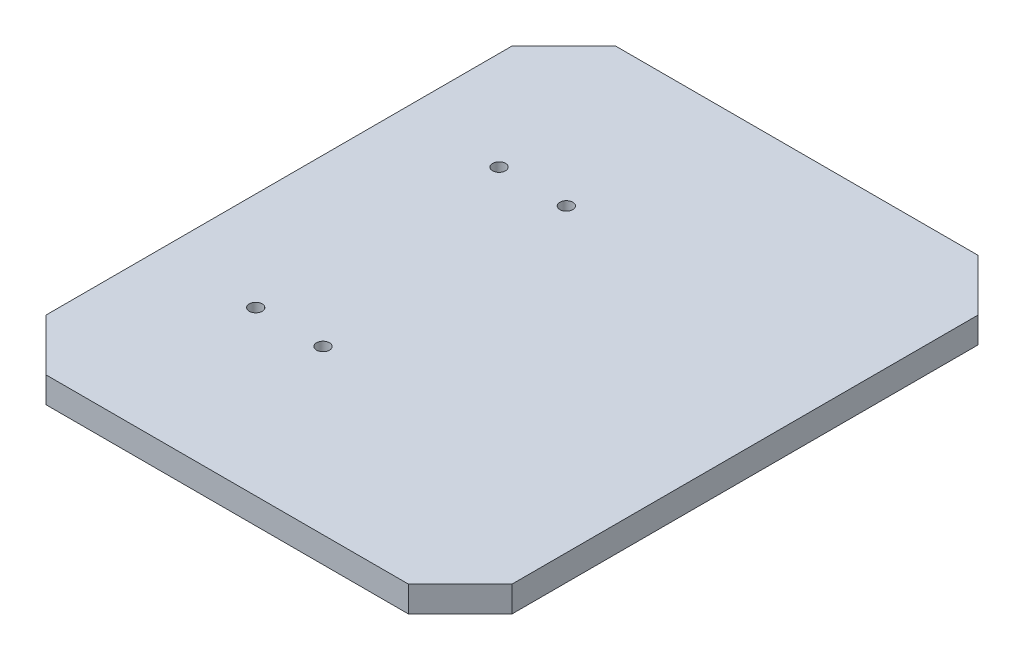
ISO-10303-21;
HEADER;
FILE_DESCRIPTION(('STEP AP214'),'2;1');
FILE_NAME('part.step','',(''),(''),'','','');
FILE_SCHEMA(('AUTOMOTIVE_DESIGN { 1 0 10303 214 1 1 1 1 }'));
ENDSEC;
DATA;
#1=APPLICATION_CONTEXT('core data for automotive mechanical design processes');
#2=APPLICATION_PROTOCOL_DEFINITION('international standard','automotive_design',2000,#1);
#3=PRODUCT_CONTEXT('',#1,'mechanical');
#4=PRODUCT('Part','Part','',(#3));
#5=PRODUCT_RELATED_PRODUCT_CATEGORY('part','',(#4));
#6=PRODUCT_DEFINITION_FORMATION('','',#4);
#7=PRODUCT_DEFINITION_CONTEXT('part definition',#1,'design');
#8=PRODUCT_DEFINITION('design','',#6,#7);
#9=PRODUCT_DEFINITION_SHAPE('','',#8);
#10=(LENGTH_UNIT() NAMED_UNIT(*) SI_UNIT(.MILLI.,.METRE.));
#11=(NAMED_UNIT(*) PLANE_ANGLE_UNIT() SI_UNIT($,.RADIAN.));
#12=(NAMED_UNIT(*) SI_UNIT($,.STERADIAN.) SOLID_ANGLE_UNIT());
#13=UNCERTAINTY_MEASURE_WITH_UNIT(LENGTH_MEASURE(1.E-05),#10,'distance_accuracy_value','');
#14=(GEOMETRIC_REPRESENTATION_CONTEXT(3) GLOBAL_UNCERTAINTY_ASSIGNED_CONTEXT((#13)) GLOBAL_UNIT_ASSIGNED_CONTEXT((#10,
#11,#12)) REPRESENTATION_CONTEXT('',''));
#15=CARTESIAN_POINT('',(0.,0.,0.));
#16=DIRECTION('',(0.,0.,1.));
#17=DIRECTION('',(1.,0.,0.));
#18=AXIS2_PLACEMENT_3D('',#15,#16,#17);
#19=CARTESIAN_POINT('',(90.,5.,0.));
#20=DIRECTION('',(0.,0.,-1.));
#21=DIRECTION('',(-1.,0.,0.));
#22=AXIS2_PLACEMENT_3D('',#19,#20,#21);
#23=PLANE('',#22);
#24=DIRECTION('',(1.,0.,0.));
#25=VECTOR('',#24,1.);
#26=CARTESIAN_POINT('',(90.,0.,0.));
#27=LINE('',#26,#25);
#28=CARTESIAN_POINT('',(10.,0.,0.));
#29=VERTEX_POINT('',#28);
#30=CARTESIAN_POINT('',(80.,0.,0.));
#31=VERTEX_POINT('',#30);
#32=EDGE_CURVE('E161',#29,#31,#27,.T.);
#33=ORIENTED_EDGE('',*,*,#32,.T.);
#34=DIRECTION('',(0.,1.,0.));
#35=VECTOR('',#34,1.);
#36=CARTESIAN_POINT('',(80.,5.,0.));
#37=LINE('',#36,#35);
#38=CARTESIAN_POINT('',(80.,5.,0.));
#39=VERTEX_POINT('',#38);
#40=EDGE_CURVE('E11',#31,#39,#37,.T.);
#41=ORIENTED_EDGE('',*,*,#40,.T.);
#42=DIRECTION('',(1.,0.,0.));
#43=VECTOR('',#42,1.);
#44=CARTESIAN_POINT('',(90.,5.,0.));
#45=LINE('',#44,#43);
#46=CARTESIAN_POINT('',(10.,5.,0.));
#47=VERTEX_POINT('',#46);
#48=EDGE_CURVE('E129',#47,#39,#45,.T.);
#49=ORIENTED_EDGE('',*,*,#48,.F.);
#50=DIRECTION('',(0.,-1.,0.));
#51=VECTOR('',#50,1.);
#52=CARTESIAN_POINT('',(10.,5.,0.));
#53=LINE('',#52,#51);
#54=EDGE_CURVE('E45',#47,#29,#53,.T.);
#55=ORIENTED_EDGE('',*,*,#54,.T.);
#56=EDGE_LOOP('',(#33,#41,#49,#55));
#57=FACE_BOUND('',#56,.T.);
#58=ADVANCED_FACE('F37',(#57),#23,.F.);
#59=CARTESIAN_POINT('',(90.,5.,-110.));
#60=DIRECTION('',(-1.,0.,0.));
#61=DIRECTION('',(0.,0.,1.));
#62=AXIS2_PLACEMENT_3D('',#59,#60,#61);
#63=PLANE('',#62);
#64=DIRECTION('',(0.,0.,-1.));
#65=VECTOR('',#64,1.);
#66=CARTESIAN_POINT('',(90.,0.,-110.));
#67=LINE('',#66,#65);
#68=CARTESIAN_POINT('',(90.,0.,-10.));
#69=VERTEX_POINT('',#68);
#70=CARTESIAN_POINT('',(90.,0.,-100.));
#71=VERTEX_POINT('',#70);
#72=EDGE_CURVE('E134',#69,#71,#67,.T.);
#73=ORIENTED_EDGE('',*,*,#72,.T.);
#74=DIRECTION('',(0.,1.,0.));
#75=VECTOR('',#74,1.);
#76=CARTESIAN_POINT('',(90.,5.,-100.));
#77=LINE('',#76,#75);
#78=CARTESIAN_POINT('',(90.,5.,-100.));
#79=VERTEX_POINT('',#78);
#80=EDGE_CURVE('E52',#71,#79,#77,.T.);
#81=ORIENTED_EDGE('',*,*,#80,.T.);
#82=DIRECTION('',(0.,0.,-1.));
#83=VECTOR('',#82,1.);
#84=CARTESIAN_POINT('',(90.,5.,-110.));
#85=LINE('',#84,#83);
#86=CARTESIAN_POINT('',(90.,5.,-10.));
#87=VERTEX_POINT('',#86);
#88=EDGE_CURVE('E132',#87,#79,#85,.T.);
#89=ORIENTED_EDGE('',*,*,#88,.F.);
#90=DIRECTION('',(0.,-1.,0.));
#91=VECTOR('',#90,1.);
#92=CARTESIAN_POINT('',(90.,5.,-10.));
#93=LINE('',#92,#91);
#94=EDGE_CURVE('E153',#87,#69,#93,.T.);
#95=ORIENTED_EDGE('',*,*,#94,.T.);
#96=EDGE_LOOP('',(#73,#81,#89,#95));
#97=FACE_BOUND('',#96,.T.);
#98=ADVANCED_FACE('F226',(#97),#63,.F.);
#99=CARTESIAN_POINT('',(0.,5.,-110.));
#100=DIRECTION('',(0.,0.,1.));
#101=DIRECTION('',(1.,0.,0.));
#102=AXIS2_PLACEMENT_3D('',#99,#100,#101);
#103=PLANE('',#102);
#104=DIRECTION('',(-1.,0.,0.));
#105=VECTOR('',#104,1.);
#106=CARTESIAN_POINT('',(0.,0.,-110.));
#107=LINE('',#106,#105);
#108=CARTESIAN_POINT('',(79.9999999999999,0.,-110.));
#109=VERTEX_POINT('',#108);
#110=CARTESIAN_POINT('',(10.,0.,-110.));
#111=VERTEX_POINT('',#110);
#112=EDGE_CURVE('E130',#109,#111,#107,.T.);
#113=ORIENTED_EDGE('',*,*,#112,.T.);
#114=DIRECTION('',(0.,1.,0.));
#115=VECTOR('',#114,1.);
#116=CARTESIAN_POINT('',(10.,5.,-110.));
#117=LINE('',#116,#115);
#118=CARTESIAN_POINT('',(10.,5.,-110.));
#119=VERTEX_POINT('',#118);
#120=EDGE_CURVE('E108',#111,#119,#117,.T.);
#121=ORIENTED_EDGE('',*,*,#120,.T.);
#122=DIRECTION('',(-1.,0.,0.));
#123=VECTOR('',#122,1.);
#124=CARTESIAN_POINT('',(0.,5.,-110.));
#125=LINE('',#124,#123);
#126=CARTESIAN_POINT('',(79.9999999999999,5.,-110.));
#127=VERTEX_POINT('',#126);
#128=EDGE_CURVE('E173',#127,#119,#125,.T.);
#129=ORIENTED_EDGE('',*,*,#128,.F.);
#130=DIRECTION('',(0.,-1.,0.));
#131=VECTOR('',#130,1.);
#132=CARTESIAN_POINT('',(80.,5.,-110.));
#133=LINE('',#132,#131);
#134=EDGE_CURVE('E113',#127,#109,#133,.T.);
#135=ORIENTED_EDGE('',*,*,#134,.T.);
#136=EDGE_LOOP('',(#113,#121,#129,#135));
#137=FACE_BOUND('',#136,.T.);
#138=ADVANCED_FACE('F231',(#137),#103,.F.);
#139=CARTESIAN_POINT('',(0.,5.,0.));
#140=DIRECTION('',(1.,0.,0.));
#141=DIRECTION('',(0.,0.,-1.));
#142=AXIS2_PLACEMENT_3D('',#139,#140,#141);
#143=PLANE('',#142);
#144=DIRECTION('',(0.,0.,1.));
#145=VECTOR('',#144,1.);
#146=CARTESIAN_POINT('',(0.,5.,0.));
#147=LINE('',#146,#145);
#148=CARTESIAN_POINT('',(0.,5.,-100.));
#149=VERTEX_POINT('',#148);
#150=CARTESIAN_POINT('',(0.,5.,-10.));
#151=VERTEX_POINT('',#150);
#152=EDGE_CURVE('E123',#149,#151,#147,.T.);
#153=ORIENTED_EDGE('',*,*,#152,.F.);
#154=DIRECTION('',(0.,-1.,0.));
#155=VECTOR('',#154,1.);
#156=CARTESIAN_POINT('',(0.,5.,-100.));
#157=LINE('',#156,#155);
#158=CARTESIAN_POINT('',(0.,0.,-100.));
#159=VERTEX_POINT('',#158);
#160=EDGE_CURVE('E107',#149,#159,#157,.T.);
#161=ORIENTED_EDGE('',*,*,#160,.T.);
#162=DIRECTION('',(0.,0.,1.));
#163=VECTOR('',#162,1.);
#164=CARTESIAN_POINT('',(0.,0.,0.));
#165=LINE('',#164,#163);
#166=CARTESIAN_POINT('',(0.,0.,-10.));
#167=VERTEX_POINT('',#166);
#168=EDGE_CURVE('E120',#159,#167,#165,.T.);
#169=ORIENTED_EDGE('',*,*,#168,.T.);
#170=DIRECTION('',(0.,1.,0.));
#171=VECTOR('',#170,1.);
#172=CARTESIAN_POINT('',(0.,5.,-10.));
#173=LINE('',#172,#171);
#174=EDGE_CURVE('E125',#167,#151,#173,.T.);
#175=ORIENTED_EDGE('',*,*,#174,.T.);
#176=EDGE_LOOP('',(#153,#161,#169,#175));
#177=FACE_BOUND('',#176,.T.);
#178=ADVANCED_FACE('F119',(#177),#143,.F.);
#179=CARTESIAN_POINT('',(0.,5.,0.));
#180=DIRECTION('',(0.,-1.,0.));
#181=DIRECTION('',(0.,0.,-1.));
#182=AXIS2_PLACEMENT_3D('',#179,#180,#181);
#183=PLANE('',#182);
#184=CARTESIAN_POINT('',(19.,5.,-78.5));
#185=DIRECTION('',(0.,-1.,0.));
#186=DIRECTION('',(0.,0.,-1.));
#187=AXIS2_PLACEMENT_3D('',#184,#185,#186);
#188=CIRCLE('',#187,1.25);
#189=CARTESIAN_POINT('',(19.,5.,-79.75));
#190=VERTEX_POINT('',#189);
#191=EDGE_CURVE('E191',#190,#190,#188,.T.);
#192=ORIENTED_EDGE('',*,*,#191,.T.);
#193=EDGE_LOOP('',(#192));
#194=FACE_BOUND('',#193,.T.);
#195=CARTESIAN_POINT('',(19.,5.,-31.5));
#196=DIRECTION('',(0.,-1.,0.));
#197=DIRECTION('',(0.,0.,-1.));
#198=AXIS2_PLACEMENT_3D('',#195,#196,#197);
#199=CIRCLE('',#198,1.25);
#200=CARTESIAN_POINT('',(19.,5.,-32.75));
#201=VERTEX_POINT('',#200);
#202=EDGE_CURVE('E185',#201,#201,#199,.T.);
#203=ORIENTED_EDGE('',*,*,#202,.T.);
#204=EDGE_LOOP('',(#203));
#205=FACE_BOUND('',#204,.T.);
#206=CARTESIAN_POINT('',(32.,5.,-31.5));
#207=DIRECTION('',(0.,-1.,0.));
#208=DIRECTION('',(0.,0.,-1.));
#209=AXIS2_PLACEMENT_3D('',#206,#207,#208);
#210=CIRCLE('',#209,1.25);
#211=CARTESIAN_POINT('',(32.,5.,-32.75));
#212=VERTEX_POINT('',#211);
#213=EDGE_CURVE('E179',#212,#212,#210,.T.);
#214=ORIENTED_EDGE('',*,*,#213,.T.);
#215=EDGE_LOOP('',(#214));
#216=FACE_BOUND('',#215,.T.);
#217=CARTESIAN_POINT('',(32.,5.,-78.5));
#218=DIRECTION('',(0.,-1.,0.));
#219=DIRECTION('',(0.,0.,-1.));
#220=AXIS2_PLACEMENT_3D('',#217,#218,#219);
#221=CIRCLE('',#220,1.25);
#222=CARTESIAN_POINT('',(32.,5.,-79.75));
#223=VERTEX_POINT('',#222);
#224=EDGE_CURVE('E166',#223,#223,#221,.T.);
#225=ORIENTED_EDGE('',*,*,#224,.T.);
#226=EDGE_LOOP('',(#225));
#227=FACE_BOUND('',#226,.T.);
#228=ORIENTED_EDGE('',*,*,#128,.T.);
#229=DIRECTION('',(0.707106781186548,0.,-0.707106781186548));
#230=VECTOR('',#229,1.);
#231=CARTESIAN_POINT('',(0.,5.,-100.));
#232=LINE('',#231,#230);
#233=EDGE_CURVE('E151',#119,#149,#232,.F.);
#234=ORIENTED_EDGE('',*,*,#233,.T.);
#235=ORIENTED_EDGE('',*,*,#152,.T.);
#236=DIRECTION('',(-0.707106781186548,0.,-0.707106781186548));
#237=VECTOR('',#236,1.);
#238=CARTESIAN_POINT('',(10.,5.,0.));
#239=LINE('',#238,#237);
#240=EDGE_CURVE('E146',#151,#47,#239,.F.);
#241=ORIENTED_EDGE('',*,*,#240,.T.);
#242=ORIENTED_EDGE('',*,*,#48,.T.);
#243=DIRECTION('',(-0.707106781186547,0.,0.707106781186548));
#244=VECTOR('',#243,1.);
#245=CARTESIAN_POINT('',(90.,5.,-10.));
#246=LINE('',#245,#244);
#247=EDGE_CURVE('E59',#39,#87,#246,.F.);
#248=ORIENTED_EDGE('',*,*,#247,.T.);
#249=ORIENTED_EDGE('',*,*,#88,.T.);
#250=DIRECTION('',(0.707106781186548,0.,0.707106781186548));
#251=VECTOR('',#250,1.);
#252=CARTESIAN_POINT('',(80.,5.,-110.));
#253=LINE('',#252,#251);
#254=EDGE_CURVE('E149',#79,#127,#253,.F.);
#255=ORIENTED_EDGE('',*,*,#254,.T.);
#256=EDGE_LOOP('',(#228,#234,#235,#241,#242,#248,#249,#255));
#257=FACE_BOUND('',#256,.T.);
#258=ADVANCED_FACE('F202',(#194,#205,#216,#227,#257),#183,.F.);
#259=CARTESIAN_POINT('',(0.,0.,0.));
#260=DIRECTION('',(0.,-1.,0.));
#261=DIRECTION('',(0.,0.,-1.));
#262=AXIS2_PLACEMENT_3D('',#259,#260,#261);
#263=PLANE('',#262);
#264=CARTESIAN_POINT('',(19.,0.,-78.5));
#265=DIRECTION('',(0.,-1.,0.));
#266=DIRECTION('',(0.,0.,-1.));
#267=AXIS2_PLACEMENT_3D('',#264,#265,#266);
#268=CIRCLE('',#267,1.25);
#269=CARTESIAN_POINT('',(19.,0.,-79.75));
#270=VERTEX_POINT('',#269);
#271=EDGE_CURVE('E194',#270,#270,#268,.T.);
#272=ORIENTED_EDGE('',*,*,#271,.F.);
#273=EDGE_LOOP('',(#272));
#274=FACE_BOUND('',#273,.T.);
#275=CARTESIAN_POINT('',(19.,0.,-31.5));
#276=DIRECTION('',(0.,-1.,0.));
#277=DIRECTION('',(0.,0.,-1.));
#278=AXIS2_PLACEMENT_3D('',#275,#276,#277);
#279=CIRCLE('',#278,1.25);
#280=CARTESIAN_POINT('',(19.,0.,-32.75));
#281=VERTEX_POINT('',#280);
#282=EDGE_CURVE('E188',#281,#281,#279,.T.);
#283=ORIENTED_EDGE('',*,*,#282,.F.);
#284=EDGE_LOOP('',(#283));
#285=FACE_BOUND('',#284,.T.);
#286=CARTESIAN_POINT('',(32.,0.,-31.5));
#287=DIRECTION('',(0.,-1.,0.));
#288=DIRECTION('',(0.,0.,-1.));
#289=AXIS2_PLACEMENT_3D('',#286,#287,#288);
#290=CIRCLE('',#289,1.25);
#291=CARTESIAN_POINT('',(32.,0.,-32.75));
#292=VERTEX_POINT('',#291);
#293=EDGE_CURVE('E182',#292,#292,#290,.T.);
#294=ORIENTED_EDGE('',*,*,#293,.F.);
#295=EDGE_LOOP('',(#294));
#296=FACE_BOUND('',#295,.T.);
#297=CARTESIAN_POINT('',(32.,0.,-78.5));
#298=DIRECTION('',(0.,-1.,0.));
#299=DIRECTION('',(0.,0.,-1.));
#300=AXIS2_PLACEMENT_3D('',#297,#298,#299);
#301=CIRCLE('',#300,1.25);
#302=CARTESIAN_POINT('',(32.,0.,-79.75));
#303=VERTEX_POINT('',#302);
#304=EDGE_CURVE('E169',#303,#303,#301,.T.);
#305=ORIENTED_EDGE('',*,*,#304,.F.);
#306=EDGE_LOOP('',(#305));
#307=FACE_BOUND('',#306,.T.);
#308=ORIENTED_EDGE('',*,*,#168,.F.);
#309=DIRECTION('',(-0.707106781186548,0.,0.707106781186548));
#310=VECTOR('',#309,1.);
#311=CARTESIAN_POINT('',(-50.,0.,-50.));
#312=LINE('',#311,#310);
#313=EDGE_CURVE('E103',#159,#111,#312,.F.);
#314=ORIENTED_EDGE('',*,*,#313,.T.);
#315=ORIENTED_EDGE('',*,*,#112,.F.);
#316=DIRECTION('',(-0.707106781186548,0.,-0.707106781186548));
#317=VECTOR('',#316,1.);
#318=CARTESIAN_POINT('',(95.,0.,-95.));
#319=LINE('',#318,#317);
#320=EDGE_CURVE('E114',#109,#71,#319,.F.);
#321=ORIENTED_EDGE('',*,*,#320,.T.);
#322=ORIENTED_EDGE('',*,*,#72,.F.);
#323=DIRECTION('',(0.707106781186547,0.,-0.707106781186548));
#324=VECTOR('',#323,1.);
#325=CARTESIAN_POINT('',(40.,0.,40.));
#326=LINE('',#325,#324);
#327=EDGE_CURVE('E140',#69,#31,#326,.F.);
#328=ORIENTED_EDGE('',*,*,#327,.T.);
#329=ORIENTED_EDGE('',*,*,#32,.F.);
#330=DIRECTION('',(0.707106781186548,0.,0.707106781186548));
#331=VECTOR('',#330,1.);
#332=CARTESIAN_POINT('',(5.00000000000001,0.,-5.00000000000001));
#333=LINE('',#332,#331);
#334=EDGE_CURVE('E124',#29,#167,#333,.F.);
#335=ORIENTED_EDGE('',*,*,#334,.T.);
#336=EDGE_LOOP('',(#308,#314,#315,#321,#322,#328,#329,#335));
#337=FACE_BOUND('',#336,.T.);
#338=ADVANCED_FACE('F127',(#274,#285,#296,#307,#337),#263,.T.);
#339=CARTESIAN_POINT('',(0.,5.,-100.));
#340=DIRECTION('',(0.707106781186547,0.,0.707106781186547));
#341=DIRECTION('',(0.,-1.,0.));
#342=AXIS2_PLACEMENT_3D('',#339,#340,#341);
#343=PLANE('',#342);
#344=ORIENTED_EDGE('',*,*,#233,.F.);
#345=ORIENTED_EDGE('',*,*,#120,.F.);
#346=ORIENTED_EDGE('',*,*,#313,.F.);
#347=ORIENTED_EDGE('',*,*,#160,.F.);
#348=EDGE_LOOP('',(#344,#345,#346,#347));
#349=FACE_BOUND('',#348,.T.);
#350=ADVANCED_FACE('F106',(#349),#343,.F.);
#351=CARTESIAN_POINT('',(80.,5.,-110.));
#352=DIRECTION('',(-0.707106781186548,0.,0.707106781186548));
#353=DIRECTION('',(0.,-1.,0.));
#354=AXIS2_PLACEMENT_3D('',#351,#352,#353);
#355=PLANE('',#354);
#356=ORIENTED_EDGE('',*,*,#254,.F.);
#357=ORIENTED_EDGE('',*,*,#80,.F.);
#358=ORIENTED_EDGE('',*,*,#320,.F.);
#359=ORIENTED_EDGE('',*,*,#134,.F.);
#360=EDGE_LOOP('',(#356,#357,#358,#359));
#361=FACE_BOUND('',#360,.T.);
#362=ADVANCED_FACE('F237',(#361),#355,.F.);
#363=CARTESIAN_POINT('',(90.,5.,-10.));
#364=DIRECTION('',(-0.707106781186548,0.,-0.707106781186547));
#365=DIRECTION('',(0.,-1.,0.));
#366=AXIS2_PLACEMENT_3D('',#363,#364,#365);
#367=PLANE('',#366);
#368=ORIENTED_EDGE('',*,*,#247,.F.);
#369=ORIENTED_EDGE('',*,*,#40,.F.);
#370=ORIENTED_EDGE('',*,*,#327,.F.);
#371=ORIENTED_EDGE('',*,*,#94,.F.);
#372=EDGE_LOOP('',(#368,#369,#370,#371));
#373=FACE_BOUND('',#372,.T.);
#374=ADVANCED_FACE('F222',(#373),#367,.F.);
#375=CARTESIAN_POINT('',(10.,5.,0.));
#376=DIRECTION('',(0.707106781186548,0.,-0.707106781186548));
#377=DIRECTION('',(0.,-1.,0.));
#378=AXIS2_PLACEMENT_3D('',#375,#376,#377);
#379=PLANE('',#378);
#380=ORIENTED_EDGE('',*,*,#240,.F.);
#381=ORIENTED_EDGE('',*,*,#174,.F.);
#382=ORIENTED_EDGE('',*,*,#334,.F.);
#383=ORIENTED_EDGE('',*,*,#54,.F.);
#384=EDGE_LOOP('',(#380,#381,#382,#383));
#385=FACE_BOUND('',#384,.T.);
#386=ADVANCED_FACE('F39',(#385),#379,.F.);
#387=CARTESIAN_POINT('',(32.,0.,-78.5));
#388=DIRECTION('',(0.,-1.,0.));
#389=DIRECTION('',(0.,0.,-1.));
#390=AXIS2_PLACEMENT_3D('',#387,#388,#389);
#391=CYLINDRICAL_SURFACE('',#390,1.25);
#392=ORIENTED_EDGE('',*,*,#224,.F.);
#393=EDGE_LOOP('',(#392));
#394=FACE_BOUND('',#393,.T.);
#395=ORIENTED_EDGE('',*,*,#304,.T.);
#396=EDGE_LOOP('',(#395));
#397=FACE_BOUND('',#396,.T.);
#398=ADVANCED_FACE('F210',(#394,#397),#391,.F.);
#399=CARTESIAN_POINT('',(32.,0.,-31.5));
#400=DIRECTION('',(0.,-1.,0.));
#401=DIRECTION('',(0.,0.,-1.));
#402=AXIS2_PLACEMENT_3D('',#399,#400,#401);
#403=CYLINDRICAL_SURFACE('',#402,1.25);
#404=ORIENTED_EDGE('',*,*,#213,.F.);
#405=EDGE_LOOP('',(#404));
#406=FACE_BOUND('',#405,.T.);
#407=ORIENTED_EDGE('',*,*,#293,.T.);
#408=EDGE_LOOP('',(#407));
#409=FACE_BOUND('',#408,.T.);
#410=ADVANCED_FACE('F212',(#406,#409),#403,.F.);
#411=CARTESIAN_POINT('',(19.,0.,-31.5));
#412=DIRECTION('',(0.,-1.,0.));
#413=DIRECTION('',(0.,0.,-1.));
#414=AXIS2_PLACEMENT_3D('',#411,#412,#413);
#415=CYLINDRICAL_SURFACE('',#414,1.25);
#416=ORIENTED_EDGE('',*,*,#202,.F.);
#417=EDGE_LOOP('',(#416));
#418=FACE_BOUND('',#417,.T.);
#419=ORIENTED_EDGE('',*,*,#282,.T.);
#420=EDGE_LOOP('',(#419));
#421=FACE_BOUND('',#420,.T.);
#422=ADVANCED_FACE('F219',(#418,#421),#415,.F.);
#423=CARTESIAN_POINT('',(19.,0.,-78.5));
#424=DIRECTION('',(0.,-1.,0.));
#425=DIRECTION('',(0.,0.,-1.));
#426=AXIS2_PLACEMENT_3D('',#423,#424,#425);
#427=CYLINDRICAL_SURFACE('',#426,1.25);
#428=ORIENTED_EDGE('',*,*,#191,.F.);
#429=EDGE_LOOP('',(#428));
#430=FACE_BOUND('',#429,.T.);
#431=ORIENTED_EDGE('',*,*,#271,.T.);
#432=EDGE_LOOP('',(#431));
#433=FACE_BOUND('',#432,.T.);
#434=ADVANCED_FACE('F198',(#430,#433),#427,.F.);
#435=CLOSED_SHELL('',(#58,#98,#138,#178,#258,#338,#350,#362,#374,#386,#398,#410,#422,#434));
#436=MANIFOLD_SOLID_BREP('B2',#435);
#437=ADVANCED_BREP_SHAPE_REPRESENTATION('',(#18,#436),#14);
#438=SHAPE_DEFINITION_REPRESENTATION(#9,#437);
ENDSEC;
END-ISO-10303-21;
